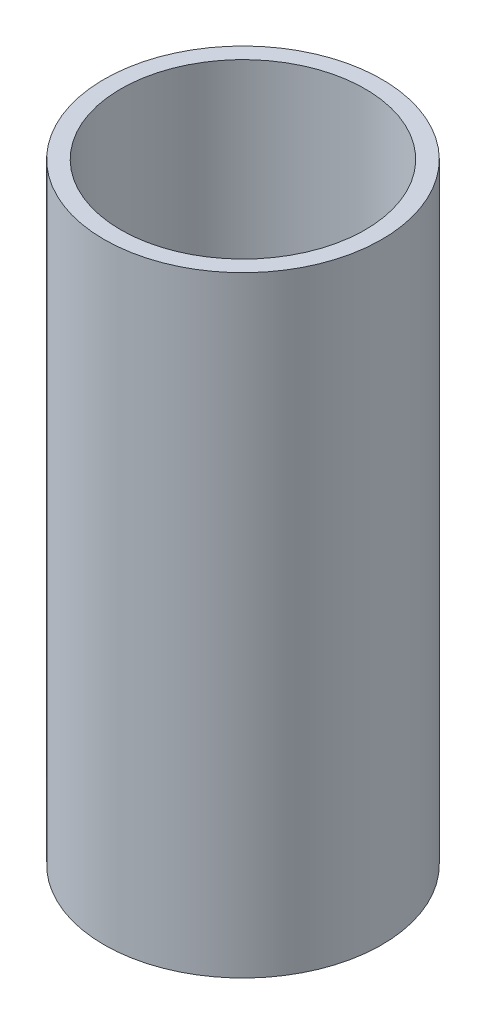
ISO-10303-21;
HEADER;
FILE_DESCRIPTION(('STEP AP214'),'2;1');
FILE_NAME('part.step','',(''),(''),'','','');
FILE_SCHEMA(('AUTOMOTIVE_DESIGN { 1 0 10303 214 1 1 1 1 }'));
ENDSEC;
DATA;
#1=APPLICATION_CONTEXT('core data for automotive mechanical design processes');
#2=APPLICATION_PROTOCOL_DEFINITION('international standard','automotive_design',2000,#1);
#3=PRODUCT_CONTEXT('',#1,'mechanical');
#4=PRODUCT('Part','Part','',(#3));
#5=PRODUCT_RELATED_PRODUCT_CATEGORY('part','',(#4));
#6=PRODUCT_DEFINITION_FORMATION('','',#4);
#7=PRODUCT_DEFINITION_CONTEXT('part definition',#1,'design');
#8=PRODUCT_DEFINITION('design','',#6,#7);
#9=PRODUCT_DEFINITION_SHAPE('','',#8);
#10=(LENGTH_UNIT() NAMED_UNIT(*) SI_UNIT(.MILLI.,.METRE.));
#11=(NAMED_UNIT(*) PLANE_ANGLE_UNIT() SI_UNIT($,.RADIAN.));
#12=(NAMED_UNIT(*) SI_UNIT($,.STERADIAN.) SOLID_ANGLE_UNIT());
#13=UNCERTAINTY_MEASURE_WITH_UNIT(LENGTH_MEASURE(1.E-05),#10,'distance_accuracy_value','');
#14=(GEOMETRIC_REPRESENTATION_CONTEXT(3) GLOBAL_UNCERTAINTY_ASSIGNED_CONTEXT((#13)) GLOBAL_UNIT_ASSIGNED_CONTEXT((#10,
#11,#12)) REPRESENTATION_CONTEXT('',''));
#15=CARTESIAN_POINT('',(0.,0.,0.));
#16=DIRECTION('',(0.,0.,1.));
#17=DIRECTION('',(1.,0.,0.));
#18=AXIS2_PLACEMENT_3D('',#15,#16,#17);
#19=CARTESIAN_POINT('',(0.,55.,0.));
#20=DIRECTION('',(0.,1.,0.));
#21=DIRECTION('',(0.,0.,1.));
#22=AXIS2_PLACEMENT_3D('',#19,#20,#21);
#23=PLANE('',#22);
#24=CARTESIAN_POINT('',(0.,55.,0.));
#25=DIRECTION('',(0.,1.,0.));
#26=DIRECTION('',(0.,0.,1.));
#27=AXIS2_PLACEMENT_3D('',#24,#25,#26);
#28=CIRCLE('',#27,12.5);
#29=CARTESIAN_POINT('',(0.,55.,12.5));
#30=VERTEX_POINT('',#29);
#31=EDGE_CURVE('E10',#30,#30,#28,.T.);
#32=ORIENTED_EDGE('',*,*,#31,.T.);
#33=EDGE_LOOP('',(#32));
#34=FACE_BOUND('',#33,.T.);
#35=CARTESIAN_POINT('',(0.,55.,0.));
#36=DIRECTION('',(0.,1.,0.));
#37=DIRECTION('',(0.,0.,1.));
#38=AXIS2_PLACEMENT_3D('',#35,#36,#37);
#39=CIRCLE('',#38,11.);
#40=CARTESIAN_POINT('',(0.,55.,11.));
#41=VERTEX_POINT('',#40);
#42=EDGE_CURVE('E48',#41,#41,#39,.T.);
#43=ORIENTED_EDGE('',*,*,#42,.F.);
#44=EDGE_LOOP('',(#43));
#45=FACE_BOUND('',#44,.T.);
#46=ADVANCED_FACE('F37',(#34,#45),#23,.T.);
#47=CARTESIAN_POINT('',(0.,0.,0.));
#48=DIRECTION('',(0.,1.,0.));
#49=DIRECTION('',(0.,0.,1.));
#50=AXIS2_PLACEMENT_3D('',#47,#48,#49);
#51=PLANE('',#50);
#52=CARTESIAN_POINT('',(0.,0.,0.));
#53=DIRECTION('',(0.,1.,0.));
#54=DIRECTION('',(0.,0.,1.));
#55=AXIS2_PLACEMENT_3D('',#52,#53,#54);
#56=CIRCLE('',#55,12.5);
#57=CARTESIAN_POINT('',(0.,0.,12.5));
#58=VERTEX_POINT('',#57);
#59=EDGE_CURVE('E41',#58,#58,#56,.T.);
#60=ORIENTED_EDGE('',*,*,#59,.F.);
#61=EDGE_LOOP('',(#60));
#62=FACE_BOUND('',#61,.T.);
#63=CARTESIAN_POINT('',(0.,0.,0.));
#64=DIRECTION('',(0.,1.,0.));
#65=DIRECTION('',(0.,0.,1.));
#66=AXIS2_PLACEMENT_3D('',#63,#64,#65);
#67=CIRCLE('',#66,11.);
#68=CARTESIAN_POINT('',(0.,0.,11.));
#69=VERTEX_POINT('',#68);
#70=EDGE_CURVE('E50',#69,#69,#67,.T.);
#71=ORIENTED_EDGE('',*,*,#70,.T.);
#72=EDGE_LOOP('',(#71));
#73=FACE_BOUND('',#72,.T.);
#74=ADVANCED_FACE('F60',(#62,#73),#51,.F.);
#75=CARTESIAN_POINT('',(0.,55.,0.));
#76=DIRECTION('',(0.,-1.,0.));
#77=DIRECTION('',(0.,0.,-1.));
#78=AXIS2_PLACEMENT_3D('',#75,#76,#77);
#79=CYLINDRICAL_SURFACE('',#78,12.5);
#80=ORIENTED_EDGE('',*,*,#31,.F.);
#81=EDGE_LOOP('',(#80));
#82=FACE_BOUND('',#81,.T.);
#83=ORIENTED_EDGE('',*,*,#59,.T.);
#84=EDGE_LOOP('',(#83));
#85=FACE_BOUND('',#84,.T.);
#86=ADVANCED_FACE('F39',(#82,#85),#79,.T.);
#87=CARTESIAN_POINT('',(0.,55.,0.));
#88=DIRECTION('',(0.,-1.,0.));
#89=DIRECTION('',(0.,0.,-1.));
#90=AXIS2_PLACEMENT_3D('',#87,#88,#89);
#91=CYLINDRICAL_SURFACE('',#90,11.);
#92=ORIENTED_EDGE('',*,*,#42,.T.);
#93=EDGE_LOOP('',(#92));
#94=FACE_BOUND('',#93,.T.);
#95=ORIENTED_EDGE('',*,*,#70,.F.);
#96=EDGE_LOOP('',(#95));
#97=FACE_BOUND('',#96,.T.);
#98=ADVANCED_FACE('F56',(#94,#97),#91,.F.);
#99=CLOSED_SHELL('',(#46,#74,#86,#98));
#100=MANIFOLD_SOLID_BREP('B2',#99);
#101=ADVANCED_BREP_SHAPE_REPRESENTATION('',(#18,#100),#14);
#102=SHAPE_DEFINITION_REPRESENTATION(#9,#101);
ENDSEC;
END-ISO-10303-21;
